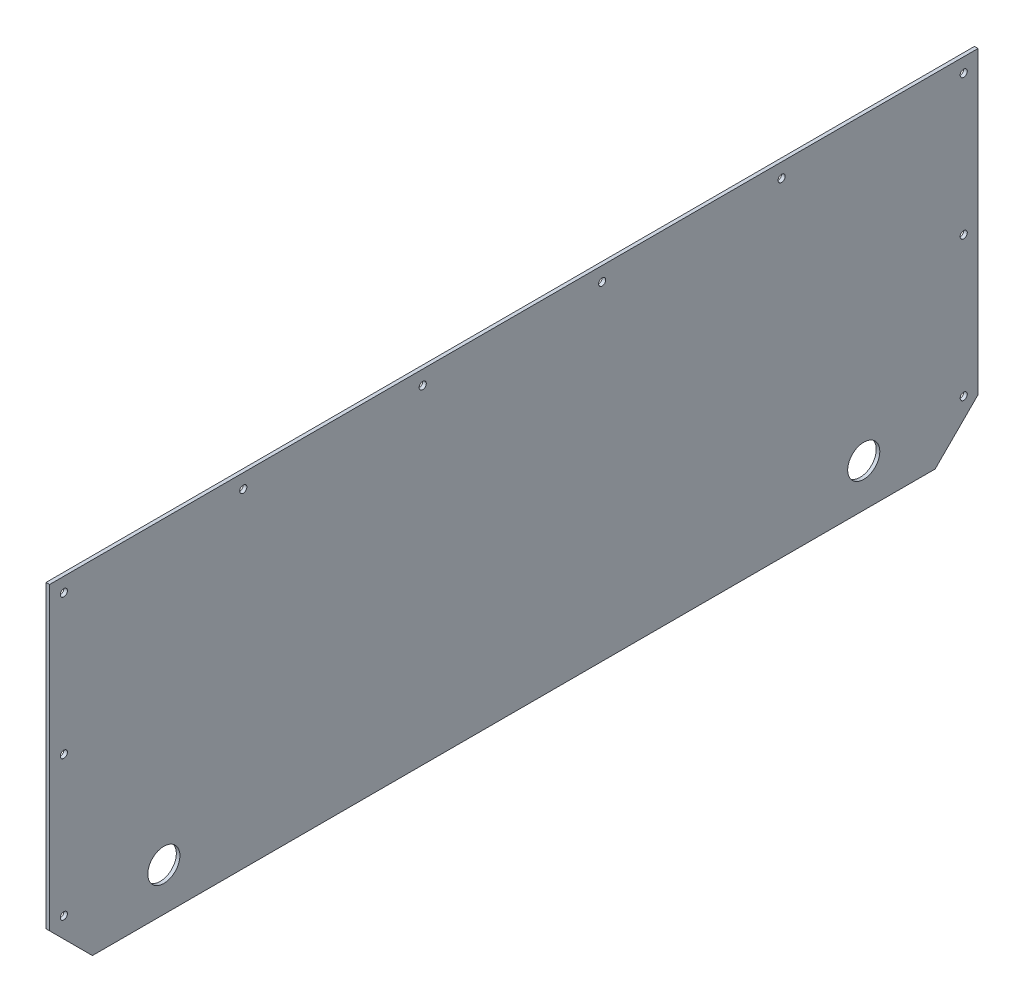
ISO-10303-21;
HEADER;
FILE_DESCRIPTION(('STEP AP214'),'2;1');
FILE_NAME('part.step','',(''),(''),'','','');
FILE_SCHEMA(('AUTOMOTIVE_DESIGN { 1 0 10303 214 1 1 1 1 }'));
ENDSEC;
DATA;
#1=APPLICATION_CONTEXT('core data for automotive mechanical design processes');
#2=APPLICATION_PROTOCOL_DEFINITION('international standard','automotive_design',2000,#1);
#3=PRODUCT_CONTEXT('',#1,'mechanical');
#4=PRODUCT('Part','Part','',(#3));
#5=PRODUCT_RELATED_PRODUCT_CATEGORY('part','',(#4));
#6=PRODUCT_DEFINITION_FORMATION('','',#4);
#7=PRODUCT_DEFINITION_CONTEXT('part definition',#1,'design');
#8=PRODUCT_DEFINITION('design','',#6,#7);
#9=PRODUCT_DEFINITION_SHAPE('','',#8);
#10=(LENGTH_UNIT() NAMED_UNIT(*) SI_UNIT(.MILLI.,.METRE.));
#11=(NAMED_UNIT(*) PLANE_ANGLE_UNIT() SI_UNIT($,.RADIAN.));
#12=(NAMED_UNIT(*) SI_UNIT($,.STERADIAN.) SOLID_ANGLE_UNIT());
#13=UNCERTAINTY_MEASURE_WITH_UNIT(LENGTH_MEASURE(1.E-05),#10,'distance_accuracy_value','');
#14=(GEOMETRIC_REPRESENTATION_CONTEXT(3) GLOBAL_UNCERTAINTY_ASSIGNED_CONTEXT((#13)) GLOBAL_UNIT_ASSIGNED_CONTEXT((#10,
#11,#12)) REPRESENTATION_CONTEXT('',''));
#15=CARTESIAN_POINT('',(0.,0.,0.));
#16=DIRECTION('',(0.,0.,1.));
#17=DIRECTION('',(1.,0.,0.));
#18=AXIS2_PLACEMENT_3D('',#15,#16,#17);
#19=CARTESIAN_POINT('',(3.175,0.,412.75));
#20=DIRECTION('',(-1.,0.,0.));
#21=DIRECTION('',(0.,0.,1.));
#22=AXIS2_PLACEMENT_3D('',#19,#20,#21);
#23=PLANE('',#22);
#24=CARTESIAN_POINT('',(3.175,43.3605122421383,-400.05));
#25=DIRECTION('',(1.,0.,0.));
#26=DIRECTION('',(0.,0.,1.));
#27=AXIS2_PLACEMENT_3D('',#24,#25,#26);
#28=CIRCLE('',#27,3.17499999999997);
#29=CARTESIAN_POINT('',(3.175,43.3605122421383,-396.875));
#30=VERTEX_POINT('',#29);
#31=EDGE_CURVE('E161',#30,#30,#28,.T.);
#32=ORIENTED_EDGE('',*,*,#31,.F.);
#33=EDGE_LOOP('',(#32));
#34=FACE_BOUND('',#33,.T.);
#35=CARTESIAN_POINT('',(3.175,167.730256121069,400.049999999999));
#36=DIRECTION('',(1.,0.,0.));
#37=DIRECTION('',(0.,0.,-1.));
#38=AXIS2_PLACEMENT_3D('',#35,#36,#37);
#39=CIRCLE('',#38,3.17499999999997);
#40=CARTESIAN_POINT('',(3.175,167.730256121069,396.874999999999));
#41=VERTEX_POINT('',#40);
#42=EDGE_CURVE('E154',#41,#41,#39,.T.);
#43=ORIENTED_EDGE('',*,*,#42,.F.);
#44=EDGE_LOOP('',(#43));
#45=FACE_BOUND('',#44,.T.);
#46=CARTESIAN_POINT('',(3.175,43.3605122421383,400.05));
#47=DIRECTION('',(1.,0.,0.));
#48=DIRECTION('',(0.,0.,-1.));
#49=AXIS2_PLACEMENT_3D('',#46,#47,#48);
#50=CIRCLE('',#49,3.17499999999997);
#51=CARTESIAN_POINT('',(3.175,43.3605122421383,396.875));
#52=VERTEX_POINT('',#51);
#53=EDGE_CURVE('E173',#52,#52,#50,.T.);
#54=ORIENTED_EDGE('',*,*,#53,.F.);
#55=EDGE_LOOP('',(#54));
#56=FACE_BOUND('',#55,.T.);
#57=CARTESIAN_POINT('',(3.175,292.1,-400.05));
#58=DIRECTION('',(1.,0.,0.));
#59=DIRECTION('',(0.,0.,1.));
#60=AXIS2_PLACEMENT_3D('',#57,#58,#59);
#61=CIRCLE('',#60,3.17499999999997);
#62=CARTESIAN_POINT('',(3.175,292.1,-396.875));
#63=VERTEX_POINT('',#62);
#64=EDGE_CURVE('E166',#63,#63,#61,.T.);
#65=ORIENTED_EDGE('',*,*,#64,.F.);
#66=EDGE_LOOP('',(#65));
#67=FACE_BOUND('',#66,.T.);
#68=CARTESIAN_POINT('',(3.175,38.1,-311.15));
#69=DIRECTION('',(1.,0.,0.));
#70=DIRECTION('',(0.,0.,-1.));
#71=AXIS2_PLACEMENT_3D('',#68,#69,#70);
#72=CIRCLE('',#71,14.2875);
#73=CARTESIAN_POINT('',(3.175,38.1,-325.4375));
#74=VERTEX_POINT('',#73);
#75=EDGE_CURVE('E138',#74,#74,#72,.T.);
#76=ORIENTED_EDGE('',*,*,#75,.F.);
#77=EDGE_LOOP('',(#76));
#78=FACE_BOUND('',#77,.T.);
#79=CARTESIAN_POINT('',(3.175,292.1,400.05));
#80=DIRECTION('',(1.,0.,0.));
#81=DIRECTION('',(0.,0.,-1.));
#82=AXIS2_PLACEMENT_3D('',#79,#80,#81);
#83=CIRCLE('',#82,3.17499999999997);
#84=CARTESIAN_POINT('',(3.175,292.1,396.875));
#85=VERTEX_POINT('',#84);
#86=EDGE_CURVE('E145',#85,#85,#83,.T.);
#87=ORIENTED_EDGE('',*,*,#86,.F.);
#88=EDGE_LOOP('',(#87));
#89=FACE_BOUND('',#88,.T.);
#90=CARTESIAN_POINT('',(3.175,292.1,-238.125));
#91=DIRECTION('',(1.,0.,0.));
#92=DIRECTION('',(0.,0.,-1.));
#93=AXIS2_PLACEMENT_3D('',#90,#91,#92);
#94=CIRCLE('',#93,3.17499999999997);
#95=CARTESIAN_POINT('',(3.175,292.1,-241.3));
#96=VERTEX_POINT('',#95);
#97=EDGE_CURVE('E202',#96,#96,#94,.T.);
#98=ORIENTED_EDGE('',*,*,#97,.F.);
#99=EDGE_LOOP('',(#98));
#100=FACE_BOUND('',#99,.T.);
#101=CARTESIAN_POINT('',(3.175,167.730256121069,-400.049999999999));
#102=DIRECTION('',(1.,0.,0.));
#103=DIRECTION('',(0.,0.,1.));
#104=AXIS2_PLACEMENT_3D('',#101,#102,#103);
#105=CIRCLE('',#104,3.17499999999997);
#106=CARTESIAN_POINT('',(3.175,167.730256121069,-396.874999999999));
#107=VERTEX_POINT('',#106);
#108=EDGE_CURVE('E185',#107,#107,#105,.T.);
#109=ORIENTED_EDGE('',*,*,#108,.F.);
#110=EDGE_LOOP('',(#109));
#111=FACE_BOUND('',#110,.T.);
#112=CARTESIAN_POINT('',(3.175,292.1,240.50625));
#113=DIRECTION('',(1.,0.,0.));
#114=DIRECTION('',(0.,0.,-1.));
#115=AXIS2_PLACEMENT_3D('',#112,#113,#114);
#116=CIRCLE('',#115,3.175);
#117=CARTESIAN_POINT('',(3.175,292.1,237.33125));
#118=VERTEX_POINT('',#117);
#119=EDGE_CURVE('E178',#118,#118,#116,.T.);
#120=ORIENTED_EDGE('',*,*,#119,.F.);
#121=EDGE_LOOP('',(#120));
#122=FACE_BOUND('',#121,.T.);
#123=CARTESIAN_POINT('',(3.175,292.1,80.9625));
#124=DIRECTION('',(1.,0.,0.));
#125=DIRECTION('',(0.,0.,-1.));
#126=AXIS2_PLACEMENT_3D('',#123,#124,#125);
#127=CIRCLE('',#126,3.17499999999997);
#128=CARTESIAN_POINT('',(3.175,292.1,77.7875));
#129=VERTEX_POINT('',#128);
#130=EDGE_CURVE('E197',#129,#129,#127,.T.);
#131=ORIENTED_EDGE('',*,*,#130,.F.);
#132=EDGE_LOOP('',(#131));
#133=FACE_BOUND('',#132,.T.);
#134=CARTESIAN_POINT('',(3.175,292.1,-78.58125));
#135=DIRECTION('',(1.,0.,0.));
#136=DIRECTION('',(0.,0.,-1.));
#137=AXIS2_PLACEMENT_3D('',#134,#135,#136);
#138=CIRCLE('',#137,3.17499999999997);
#139=CARTESIAN_POINT('',(3.175,292.1,-81.75625));
#140=VERTEX_POINT('',#139);
#141=EDGE_CURVE('E190',#140,#140,#138,.T.);
#142=ORIENTED_EDGE('',*,*,#141,.F.);
#143=EDGE_LOOP('',(#142));
#144=FACE_BOUND('',#143,.T.);
#145=CARTESIAN_POINT('',(3.175,38.1,311.15));
#146=DIRECTION('',(1.,0.,0.));
#147=DIRECTION('',(0.,0.,-1.));
#148=AXIS2_PLACEMENT_3D('',#145,#146,#147);
#149=CIRCLE('',#148,14.2875);
#150=CARTESIAN_POINT('',(3.175,38.1,296.8625));
#151=VERTEX_POINT('',#150);
#152=EDGE_CURVE('E128',#151,#151,#149,.T.);
#153=ORIENTED_EDGE('',*,*,#152,.F.);
#154=EDGE_LOOP('',(#153));
#155=FACE_BOUND('',#154,.T.);
#156=DIRECTION('',(0.,1.,0.));
#157=VECTOR('',#156,1.);
#158=CARTESIAN_POINT('',(3.175,0.,412.75));
#159=LINE('',#158,#157);
#160=CARTESIAN_POINT('',(3.175,38.1,412.75));
#161=VERTEX_POINT('',#160);
#162=CARTESIAN_POINT('',(3.175,304.8,412.75));
#163=VERTEX_POINT('',#162);
#164=EDGE_CURVE('E116',#161,#163,#159,.T.);
#165=ORIENTED_EDGE('',*,*,#164,.F.);
#166=DIRECTION('',(0.,0.707106781186547,0.707106781186548));
#167=VECTOR('',#166,1.);
#168=CARTESIAN_POINT('',(3.175,38.1,412.75));
#169=LINE('',#168,#167);
#170=CARTESIAN_POINT('',(3.175,0.,374.65));
#171=VERTEX_POINT('',#170);
#172=EDGE_CURVE('E51',#171,#161,#169,.T.);
#173=ORIENTED_EDGE('',*,*,#172,.F.);
#174=DIRECTION('',(0.,0.,-1.));
#175=VECTOR('',#174,1.);
#176=CARTESIAN_POINT('',(3.175,0.,412.75));
#177=LINE('',#176,#175);
#178=CARTESIAN_POINT('',(3.175,0.,-374.65));
#179=VERTEX_POINT('',#178);
#180=EDGE_CURVE('E110',#171,#179,#177,.T.);
#181=ORIENTED_EDGE('',*,*,#180,.T.);
#182=DIRECTION('',(0.,-0.707106781186547,0.707106781186548));
#183=VECTOR('',#182,1.);
#184=CARTESIAN_POINT('',(3.175,38.1,-412.75));
#185=LINE('',#184,#183);
#186=CARTESIAN_POINT('',(3.175,38.1,-412.75));
#187=VERTEX_POINT('',#186);
#188=EDGE_CURVE('E90',#187,#179,#185,.T.);
#189=ORIENTED_EDGE('',*,*,#188,.F.);
#190=DIRECTION('',(0.,1.,0.));
#191=VECTOR('',#190,1.);
#192=CARTESIAN_POINT('',(3.175,0.,-412.75));
#193=LINE('',#192,#191);
#194=CARTESIAN_POINT('',(3.175,304.8,-412.75));
#195=VERTEX_POINT('',#194);
#196=EDGE_CURVE('E120',#187,#195,#193,.T.);
#197=ORIENTED_EDGE('',*,*,#196,.T.);
#198=DIRECTION('',(0.,0.,-1.));
#199=VECTOR('',#198,1.);
#200=CARTESIAN_POINT('',(3.175,304.8,412.75));
#201=LINE('',#200,#199);
#202=EDGE_CURVE('E11',#163,#195,#201,.T.);
#203=ORIENTED_EDGE('',*,*,#202,.F.);
#204=EDGE_LOOP('',(#165,#173,#181,#189,#197,#203));
#205=FACE_BOUND('',#204,.T.);
#206=ADVANCED_FACE('F37',(#34,#45,#56,#67,#78,#89,#100,#111,#122,#133,#144,#155,#205),#23,.F.);
#207=CARTESIAN_POINT('',(0.,304.8,412.75));
#208=DIRECTION('',(0.,1.,0.));
#209=DIRECTION('',(0.,0.,1.));
#210=AXIS2_PLACEMENT_3D('',#207,#208,#209);
#211=PLANE('',#210);
#212=DIRECTION('',(1.,0.,0.));
#213=VECTOR('',#212,1.);
#214=CARTESIAN_POINT('',(0.,304.8,-412.75));
#215=LINE('',#214,#213);
#216=CARTESIAN_POINT('',(0.,304.8,-412.75));
#217=VERTEX_POINT('',#216);
#218=EDGE_CURVE('E117',#217,#195,#215,.T.);
#219=ORIENTED_EDGE('',*,*,#218,.F.);
#220=DIRECTION('',(0.,0.,-1.));
#221=VECTOR('',#220,1.);
#222=CARTESIAN_POINT('',(0.,304.8,412.75));
#223=LINE('',#222,#221);
#224=CARTESIAN_POINT('',(0.,304.8,412.75));
#225=VERTEX_POINT('',#224);
#226=EDGE_CURVE('E44',#225,#217,#223,.T.);
#227=ORIENTED_EDGE('',*,*,#226,.F.);
#228=DIRECTION('',(1.,0.,0.));
#229=VECTOR('',#228,1.);
#230=CARTESIAN_POINT('',(0.,304.8,412.75));
#231=LINE('',#230,#229);
#232=EDGE_CURVE('E124',#225,#163,#231,.T.);
#233=ORIENTED_EDGE('',*,*,#232,.T.);
#234=ORIENTED_EDGE('',*,*,#202,.T.);
#235=EDGE_LOOP('',(#219,#227,#233,#234));
#236=FACE_BOUND('',#235,.T.);
#237=ADVANCED_FACE('F220',(#236),#211,.T.);
#238=CARTESIAN_POINT('',(0.,0.,412.75));
#239=DIRECTION('',(-1.,0.,0.));
#240=DIRECTION('',(0.,0.,1.));
#241=AXIS2_PLACEMENT_3D('',#238,#239,#240);
#242=PLANE('',#241);
#243=CARTESIAN_POINT('',(0.,43.3605122421383,-400.05));
#244=DIRECTION('',(1.,0.,0.));
#245=DIRECTION('',(0.,0.,1.));
#246=AXIS2_PLACEMENT_3D('',#243,#244,#245);
#247=CIRCLE('',#246,3.17499999999997);
#248=CARTESIAN_POINT('',(0.,43.3605122421383,-396.875));
#249=VERTEX_POINT('',#248);
#250=EDGE_CURVE('E149',#249,#249,#247,.T.);
#251=ORIENTED_EDGE('',*,*,#250,.T.);
#252=EDGE_LOOP('',(#251));
#253=FACE_BOUND('',#252,.T.);
#254=CARTESIAN_POINT('',(0.,167.730256121069,400.049999999999));
#255=DIRECTION('',(1.,0.,0.));
#256=DIRECTION('',(0.,0.,-1.));
#257=AXIS2_PLACEMENT_3D('',#254,#255,#256);
#258=CIRCLE('',#257,3.17499999999997);
#259=CARTESIAN_POINT('',(0.,167.730256121069,396.874999999999));
#260=VERTEX_POINT('',#259);
#261=EDGE_CURVE('E157',#260,#260,#258,.T.);
#262=ORIENTED_EDGE('',*,*,#261,.T.);
#263=EDGE_LOOP('',(#262));
#264=FACE_BOUND('',#263,.T.);
#265=CARTESIAN_POINT('',(0.,43.3605122421383,400.05));
#266=DIRECTION('',(1.,0.,0.));
#267=DIRECTION('',(0.,0.,-1.));
#268=AXIS2_PLACEMENT_3D('',#265,#266,#267);
#269=CIRCLE('',#268,3.17499999999997);
#270=CARTESIAN_POINT('',(0.,43.3605122421383,396.875));
#271=VERTEX_POINT('',#270);
#272=EDGE_CURVE('E158',#271,#271,#269,.T.);
#273=ORIENTED_EDGE('',*,*,#272,.T.);
#274=EDGE_LOOP('',(#273));
#275=FACE_BOUND('',#274,.T.);
#276=CARTESIAN_POINT('',(0.,292.1,-400.05));
#277=DIRECTION('',(1.,0.,0.));
#278=DIRECTION('',(0.,0.,1.));
#279=AXIS2_PLACEMENT_3D('',#276,#277,#278);
#280=CIRCLE('',#279,3.17499999999997);
#281=CARTESIAN_POINT('',(0.,292.1,-396.875));
#282=VERTEX_POINT('',#281);
#283=EDGE_CURVE('E169',#282,#282,#280,.T.);
#284=ORIENTED_EDGE('',*,*,#283,.T.);
#285=EDGE_LOOP('',(#284));
#286=FACE_BOUND('',#285,.T.);
#287=CARTESIAN_POINT('',(0.,38.1,-311.15));
#288=DIRECTION('',(1.,0.,0.));
#289=DIRECTION('',(0.,0.,-1.));
#290=AXIS2_PLACEMENT_3D('',#287,#288,#289);
#291=CIRCLE('',#290,14.2875);
#292=CARTESIAN_POINT('',(0.,38.1,-325.4375));
#293=VERTEX_POINT('',#292);
#294=EDGE_CURVE('E131',#293,#293,#291,.T.);
#295=ORIENTED_EDGE('',*,*,#294,.T.);
#296=EDGE_LOOP('',(#295));
#297=FACE_BOUND('',#296,.T.);
#298=DIRECTION('',(0.,0.707106781186547,0.707106781186548));
#299=VECTOR('',#298,1.);
#300=CARTESIAN_POINT('',(0.,38.1,412.75));
#301=LINE('',#300,#299);
#302=CARTESIAN_POINT('',(0.,0.,374.65));
#303=VERTEX_POINT('',#302);
#304=CARTESIAN_POINT('',(0.,38.1,412.75));
#305=VERTEX_POINT('',#304);
#306=EDGE_CURVE('E136',#303,#305,#301,.T.);
#307=ORIENTED_EDGE('',*,*,#306,.T.);
#308=DIRECTION('',(0.,1.,0.));
#309=VECTOR('',#308,1.);
#310=CARTESIAN_POINT('',(0.,0.,412.75));
#311=LINE('',#310,#309);
#312=EDGE_CURVE('E112',#305,#225,#311,.T.);
#313=ORIENTED_EDGE('',*,*,#312,.T.);
#314=ORIENTED_EDGE('',*,*,#226,.T.);
#315=DIRECTION('',(0.,1.,0.));
#316=VECTOR('',#315,1.);
#317=CARTESIAN_POINT('',(0.,0.,-412.75));
#318=LINE('',#317,#316);
#319=CARTESIAN_POINT('',(0.,38.1,-412.75));
#320=VERTEX_POINT('',#319);
#321=EDGE_CURVE('E105',#320,#217,#318,.T.);
#322=ORIENTED_EDGE('',*,*,#321,.F.);
#323=DIRECTION('',(0.,-0.707106781186547,0.707106781186548));
#324=VECTOR('',#323,1.);
#325=CARTESIAN_POINT('',(0.,38.1,-412.75));
#326=LINE('',#325,#324);
#327=CARTESIAN_POINT('',(0.,0.,-374.65));
#328=VERTEX_POINT('',#327);
#329=EDGE_CURVE('E59',#320,#328,#326,.T.);
#330=ORIENTED_EDGE('',*,*,#329,.T.);
#331=DIRECTION('',(0.,0.,-1.));
#332=VECTOR('',#331,1.);
#333=CARTESIAN_POINT('',(0.,0.,412.75));
#334=LINE('',#333,#332);
#335=EDGE_CURVE('E103',#303,#328,#334,.T.);
#336=ORIENTED_EDGE('',*,*,#335,.F.);
#337=EDGE_LOOP('',(#307,#313,#314,#322,#330,#336));
#338=FACE_BOUND('',#337,.T.);
#339=CARTESIAN_POINT('',(0.,292.1,400.05));
#340=DIRECTION('',(1.,0.,0.));
#341=DIRECTION('',(0.,0.,-1.));
#342=AXIS2_PLACEMENT_3D('',#339,#340,#341);
#343=CIRCLE('',#342,3.17499999999997);
#344=CARTESIAN_POINT('',(0.,292.1,396.875));
#345=VERTEX_POINT('',#344);
#346=EDGE_CURVE('E148',#345,#345,#343,.T.);
#347=ORIENTED_EDGE('',*,*,#346,.T.);
#348=EDGE_LOOP('',(#347));
#349=FACE_BOUND('',#348,.T.);
#350=CARTESIAN_POINT('',(0.,292.1,-238.125));
#351=DIRECTION('',(1.,0.,0.));
#352=DIRECTION('',(0.,0.,-1.));
#353=AXIS2_PLACEMENT_3D('',#350,#351,#352);
#354=CIRCLE('',#353,3.17499999999997);
#355=CARTESIAN_POINT('',(0.,292.1,-241.3));
#356=VERTEX_POINT('',#355);
#357=EDGE_CURVE('E194',#356,#356,#354,.T.);
#358=ORIENTED_EDGE('',*,*,#357,.T.);
#359=EDGE_LOOP('',(#358));
#360=FACE_BOUND('',#359,.T.);
#361=CARTESIAN_POINT('',(0.,167.730256121069,-400.049999999999));
#362=DIRECTION('',(1.,0.,0.));
#363=DIRECTION('',(0.,0.,1.));
#364=AXIS2_PLACEMENT_3D('',#361,#362,#363);
#365=CIRCLE('',#364,3.17499999999997);
#366=CARTESIAN_POINT('',(0.,167.730256121069,-396.874999999999));
#367=VERTEX_POINT('',#366);
#368=EDGE_CURVE('E170',#367,#367,#365,.T.);
#369=ORIENTED_EDGE('',*,*,#368,.T.);
#370=EDGE_LOOP('',(#369));
#371=FACE_BOUND('',#370,.T.);
#372=CARTESIAN_POINT('',(0.,292.1,240.50625));
#373=DIRECTION('',(1.,0.,0.));
#374=DIRECTION('',(0.,0.,-1.));
#375=AXIS2_PLACEMENT_3D('',#372,#373,#374);
#376=CIRCLE('',#375,3.175);
#377=CARTESIAN_POINT('',(0.,292.1,237.33125));
#378=VERTEX_POINT('',#377);
#379=EDGE_CURVE('E181',#378,#378,#376,.T.);
#380=ORIENTED_EDGE('',*,*,#379,.T.);
#381=EDGE_LOOP('',(#380));
#382=FACE_BOUND('',#381,.T.);
#383=CARTESIAN_POINT('',(0.,292.1,80.9625));
#384=DIRECTION('',(1.,0.,0.));
#385=DIRECTION('',(0.,0.,-1.));
#386=AXIS2_PLACEMENT_3D('',#383,#384,#385);
#387=CIRCLE('',#386,3.17499999999997);
#388=CARTESIAN_POINT('',(0.,292.1,77.7875));
#389=VERTEX_POINT('',#388);
#390=EDGE_CURVE('E182',#389,#389,#387,.T.);
#391=ORIENTED_EDGE('',*,*,#390,.T.);
#392=EDGE_LOOP('',(#391));
#393=FACE_BOUND('',#392,.T.);
#394=CARTESIAN_POINT('',(0.,292.1,-78.58125));
#395=DIRECTION('',(1.,0.,0.));
#396=DIRECTION('',(0.,0.,-1.));
#397=AXIS2_PLACEMENT_3D('',#394,#395,#396);
#398=CIRCLE('',#397,3.17499999999997);
#399=CARTESIAN_POINT('',(0.,292.1,-81.75625));
#400=VERTEX_POINT('',#399);
#401=EDGE_CURVE('E193',#400,#400,#398,.T.);
#402=ORIENTED_EDGE('',*,*,#401,.T.);
#403=EDGE_LOOP('',(#402));
#404=FACE_BOUND('',#403,.T.);
#405=CARTESIAN_POINT('',(0.,38.1,311.15));
#406=DIRECTION('',(1.,0.,0.));
#407=DIRECTION('',(0.,0.,-1.));
#408=AXIS2_PLACEMENT_3D('',#405,#406,#407);
#409=CIRCLE('',#408,14.2875);
#410=CARTESIAN_POINT('',(0.,38.1,296.8625));
#411=VERTEX_POINT('',#410);
#412=EDGE_CURVE('E122',#411,#411,#409,.T.);
#413=ORIENTED_EDGE('',*,*,#412,.T.);
#414=EDGE_LOOP('',(#413));
#415=FACE_BOUND('',#414,.T.);
#416=ADVANCED_FACE('F101',(#253,#264,#275,#286,#297,#338,#349,#360,#371,#382,#393,#404,#415),
#242,.T.);
#417=CARTESIAN_POINT('',(3.175,0.,412.75));
#418=DIRECTION('',(0.,-1.,0.));
#419=DIRECTION('',(0.,0.,-1.));
#420=AXIS2_PLACEMENT_3D('',#417,#418,#419);
#421=PLANE('',#420);
#422=DIRECTION('',(1.,0.,0.));
#423=VECTOR('',#422,1.);
#424=CARTESIAN_POINT('',(0.,0.,374.65));
#425=LINE('',#424,#423);
#426=EDGE_CURVE('E109',#303,#171,#425,.T.);
#427=ORIENTED_EDGE('',*,*,#426,.F.);
#428=ORIENTED_EDGE('',*,*,#335,.T.);
#429=DIRECTION('',(1.,0.,0.));
#430=VECTOR('',#429,1.);
#431=CARTESIAN_POINT('',(0.,0.,-374.65));
#432=LINE('',#431,#430);
#433=EDGE_CURVE('E87',#328,#179,#432,.T.);
#434=ORIENTED_EDGE('',*,*,#433,.T.);
#435=ORIENTED_EDGE('',*,*,#180,.F.);
#436=EDGE_LOOP('',(#427,#428,#434,#435));
#437=FACE_BOUND('',#436,.T.);
#438=ADVANCED_FACE('F108',(#437),#421,.T.);
#439=CARTESIAN_POINT('',(0.,0.,412.75));
#440=DIRECTION('',(0.,0.,-1.));
#441=DIRECTION('',(-1.,0.,0.));
#442=AXIS2_PLACEMENT_3D('',#439,#440,#441);
#443=PLANE('',#442);
#444=ORIENTED_EDGE('',*,*,#312,.F.);
#445=DIRECTION('',(1.,0.,0.));
#446=VECTOR('',#445,1.);
#447=CARTESIAN_POINT('',(0.,38.1,412.75));
#448=LINE('',#447,#446);
#449=EDGE_CURVE('E135',#305,#161,#448,.T.);
#450=ORIENTED_EDGE('',*,*,#449,.T.);
#451=ORIENTED_EDGE('',*,*,#164,.T.);
#452=ORIENTED_EDGE('',*,*,#232,.F.);
#453=EDGE_LOOP('',(#444,#450,#451,#452));
#454=FACE_BOUND('',#453,.T.);
#455=ADVANCED_FACE('F237',(#454),#443,.F.);
#456=CARTESIAN_POINT('',(0.,0.,-412.75));
#457=DIRECTION('',(0.,0.,-1.));
#458=DIRECTION('',(-1.,0.,0.));
#459=AXIS2_PLACEMENT_3D('',#456,#457,#458);
#460=PLANE('',#459);
#461=DIRECTION('',(1.,0.,0.));
#462=VECTOR('',#461,1.);
#463=CARTESIAN_POINT('',(0.,38.1,-412.75));
#464=LINE('',#463,#462);
#465=EDGE_CURVE('E95',#320,#187,#464,.T.);
#466=ORIENTED_EDGE('',*,*,#465,.F.);
#467=ORIENTED_EDGE('',*,*,#321,.T.);
#468=ORIENTED_EDGE('',*,*,#218,.T.);
#469=ORIENTED_EDGE('',*,*,#196,.F.);
#470=EDGE_LOOP('',(#466,#467,#468,#469));
#471=FACE_BOUND('',#470,.T.);
#472=ADVANCED_FACE('F244',(#471),#460,.T.);
#473=CARTESIAN_POINT('',(0.,38.1,-412.75));
#474=DIRECTION('',(0.,0.707106781186548,0.707106781186547));
#475=DIRECTION('',(0.,-0.707106781186547,0.707106781186548));
#476=AXIS2_PLACEMENT_3D('',#473,#474,#475);
#477=PLANE('',#476);
#478=ORIENTED_EDGE('',*,*,#188,.T.);
#479=ORIENTED_EDGE('',*,*,#433,.F.);
#480=ORIENTED_EDGE('',*,*,#329,.F.);
#481=ORIENTED_EDGE('',*,*,#465,.T.);
#482=EDGE_LOOP('',(#478,#479,#480,#481));
#483=FACE_BOUND('',#482,.T.);
#484=ADVANCED_FACE('F88',(#483),#477,.F.);
#485=CARTESIAN_POINT('',(0.,38.1,412.75));
#486=DIRECTION('',(0.,0.707106781186548,-0.707106781186547));
#487=DIRECTION('',(0.,0.707106781186547,0.707106781186548));
#488=AXIS2_PLACEMENT_3D('',#485,#486,#487);
#489=PLANE('',#488);
#490=ORIENTED_EDGE('',*,*,#172,.T.);
#491=ORIENTED_EDGE('',*,*,#449,.F.);
#492=ORIENTED_EDGE('',*,*,#306,.F.);
#493=ORIENTED_EDGE('',*,*,#426,.T.);
#494=EDGE_LOOP('',(#490,#491,#492,#493));
#495=FACE_BOUND('',#494,.T.);
#496=ADVANCED_FACE('F238',(#495),#489,.F.);
#497=CARTESIAN_POINT('',(0.,38.1,311.15));
#498=DIRECTION('',(1.,0.,0.));
#499=DIRECTION('',(0.,0.,-1.));
#500=AXIS2_PLACEMENT_3D('',#497,#498,#499);
#501=CYLINDRICAL_SURFACE('',#500,14.2875);
#502=ORIENTED_EDGE('',*,*,#412,.F.);
#503=EDGE_LOOP('',(#502));
#504=FACE_BOUND('',#503,.T.);
#505=ORIENTED_EDGE('',*,*,#152,.T.);
#506=EDGE_LOOP('',(#505));
#507=FACE_BOUND('',#506,.T.);
#508=ADVANCED_FACE('F298',(#504,#507),#501,.F.);
#509=CARTESIAN_POINT('',(0.,292.1,-78.58125));
#510=DIRECTION('',(1.,0.,0.));
#511=DIRECTION('',(0.,0.,-1.));
#512=AXIS2_PLACEMENT_3D('',#509,#510,#511);
#513=CYLINDRICAL_SURFACE('',#512,3.17499999999997);
#514=ORIENTED_EDGE('',*,*,#401,.F.);
#515=EDGE_LOOP('',(#514));
#516=FACE_BOUND('',#515,.T.);
#517=ORIENTED_EDGE('',*,*,#141,.T.);
#518=EDGE_LOOP('',(#517));
#519=FACE_BOUND('',#518,.T.);
#520=ADVANCED_FACE('F308',(#516,#519),#513,.F.);
#521=CARTESIAN_POINT('',(0.,292.1,80.9625));
#522=DIRECTION('',(1.,0.,0.));
#523=DIRECTION('',(0.,0.,-1.));
#524=AXIS2_PLACEMENT_3D('',#521,#522,#523);
#525=CYLINDRICAL_SURFACE('',#524,3.17499999999997);
#526=ORIENTED_EDGE('',*,*,#390,.F.);
#527=EDGE_LOOP('',(#526));
#528=FACE_BOUND('',#527,.T.);
#529=ORIENTED_EDGE('',*,*,#130,.T.);
#530=EDGE_LOOP('',(#529));
#531=FACE_BOUND('',#530,.T.);
#532=ADVANCED_FACE('F318',(#528,#531),#525,.F.);
#533=CARTESIAN_POINT('',(0.,292.1,240.50625));
#534=DIRECTION('',(1.,0.,0.));
#535=DIRECTION('',(0.,0.,-1.));
#536=AXIS2_PLACEMENT_3D('',#533,#534,#535);
#537=CYLINDRICAL_SURFACE('',#536,3.175);
#538=ORIENTED_EDGE('',*,*,#379,.F.);
#539=EDGE_LOOP('',(#538));
#540=FACE_BOUND('',#539,.T.);
#541=ORIENTED_EDGE('',*,*,#119,.T.);
#542=EDGE_LOOP('',(#541));
#543=FACE_BOUND('',#542,.T.);
#544=ADVANCED_FACE('F329',(#540,#543),#537,.F.);
#545=CARTESIAN_POINT('',(0.,167.730256121069,-400.049999999999));
#546=DIRECTION('',(1.,0.,0.));
#547=DIRECTION('',(0.,0.,-1.));
#548=AXIS2_PLACEMENT_3D('',#545,#546,#547);
#549=CYLINDRICAL_SURFACE('',#548,3.17499999999997);
#550=ORIENTED_EDGE('',*,*,#368,.F.);
#551=EDGE_LOOP('',(#550));
#552=FACE_BOUND('',#551,.T.);
#553=ORIENTED_EDGE('',*,*,#108,.T.);
#554=EDGE_LOOP('',(#553));
#555=FACE_BOUND('',#554,.T.);
#556=ADVANCED_FACE('F214',(#552,#555),#549,.F.);
#557=CARTESIAN_POINT('',(0.,292.1,-238.125));
#558=DIRECTION('',(1.,0.,0.));
#559=DIRECTION('',(0.,0.,-1.));
#560=AXIS2_PLACEMENT_3D('',#557,#558,#559);
#561=CYLINDRICAL_SURFACE('',#560,3.17499999999997);
#562=ORIENTED_EDGE('',*,*,#357,.F.);
#563=EDGE_LOOP('',(#562));
#564=FACE_BOUND('',#563,.T.);
#565=ORIENTED_EDGE('',*,*,#97,.T.);
#566=EDGE_LOOP('',(#565));
#567=FACE_BOUND('',#566,.T.);
#568=ADVANCED_FACE('F210',(#564,#567),#561,.F.);
#569=CARTESIAN_POINT('',(0.,292.1,400.05));
#570=DIRECTION('',(1.,0.,0.));
#571=DIRECTION('',(0.,0.,-1.));
#572=AXIS2_PLACEMENT_3D('',#569,#570,#571);
#573=CYLINDRICAL_SURFACE('',#572,3.17499999999997);
#574=ORIENTED_EDGE('',*,*,#346,.F.);
#575=EDGE_LOOP('',(#574));
#576=FACE_BOUND('',#575,.T.);
#577=ORIENTED_EDGE('',*,*,#86,.T.);
#578=EDGE_LOOP('',(#577));
#579=FACE_BOUND('',#578,.T.);
#580=ADVANCED_FACE('F213',(#576,#579),#573,.F.);
#581=CARTESIAN_POINT('',(0.,38.1,-311.15));
#582=DIRECTION('',(1.,0.,0.));
#583=DIRECTION('',(0.,0.,-1.));
#584=AXIS2_PLACEMENT_3D('',#581,#582,#583);
#585=CYLINDRICAL_SURFACE('',#584,14.2875);
#586=ORIENTED_EDGE('',*,*,#294,.F.);
#587=EDGE_LOOP('',(#586));
#588=FACE_BOUND('',#587,.T.);
#589=ORIENTED_EDGE('',*,*,#75,.T.);
#590=EDGE_LOOP('',(#589));
#591=FACE_BOUND('',#590,.T.);
#592=ADVANCED_FACE('F367',(#588,#591),#585,.F.);
#593=CARTESIAN_POINT('',(0.,292.1,-400.05));
#594=DIRECTION('',(1.,0.,0.));
#595=DIRECTION('',(0.,0.,-1.));
#596=AXIS2_PLACEMENT_3D('',#593,#594,#595);
#597=CYLINDRICAL_SURFACE('',#596,3.17499999999997);
#598=ORIENTED_EDGE('',*,*,#283,.F.);
#599=EDGE_LOOP('',(#598));
#600=FACE_BOUND('',#599,.T.);
#601=ORIENTED_EDGE('',*,*,#64,.T.);
#602=EDGE_LOOP('',(#601));
#603=FACE_BOUND('',#602,.T.);
#604=ADVANCED_FACE('F378',(#600,#603),#597,.F.);
#605=CARTESIAN_POINT('',(0.,43.3605122421383,400.05));
#606=DIRECTION('',(1.,0.,0.));
#607=DIRECTION('',(0.,0.,-1.));
#608=AXIS2_PLACEMENT_3D('',#605,#606,#607);
#609=CYLINDRICAL_SURFACE('',#608,3.17499999999997);
#610=ORIENTED_EDGE('',*,*,#272,.F.);
#611=EDGE_LOOP('',(#610));
#612=FACE_BOUND('',#611,.T.);
#613=ORIENTED_EDGE('',*,*,#53,.T.);
#614=EDGE_LOOP('',(#613));
#615=FACE_BOUND('',#614,.T.);
#616=ADVANCED_FACE('F389',(#612,#615),#609,.F.);
#617=CARTESIAN_POINT('',(0.,167.730256121069,400.049999999999));
#618=DIRECTION('',(1.,0.,0.));
#619=DIRECTION('',(0.,0.,-1.));
#620=AXIS2_PLACEMENT_3D('',#617,#618,#619);
#621=CYLINDRICAL_SURFACE('',#620,3.17499999999997);
#622=ORIENTED_EDGE('',*,*,#261,.F.);
#623=EDGE_LOOP('',(#622));
#624=FACE_BOUND('',#623,.T.);
#625=ORIENTED_EDGE('',*,*,#42,.T.);
#626=EDGE_LOOP('',(#625));
#627=FACE_BOUND('',#626,.T.);
#628=ADVANCED_FACE('F400',(#624,#627),#621,.F.);
#629=CARTESIAN_POINT('',(0.,43.3605122421383,-400.05));
#630=DIRECTION('',(1.,0.,0.));
#631=DIRECTION('',(0.,0.,-1.));
#632=AXIS2_PLACEMENT_3D('',#629,#630,#631);
#633=CYLINDRICAL_SURFACE('',#632,3.17499999999997);
#634=ORIENTED_EDGE('',*,*,#250,.F.);
#635=EDGE_LOOP('',(#634));
#636=FACE_BOUND('',#635,.T.);
#637=ORIENTED_EDGE('',*,*,#31,.T.);
#638=EDGE_LOOP('',(#637));
#639=FACE_BOUND('',#638,.T.);
#640=ADVANCED_FACE('F411',(#636,#639),#633,.F.);
#641=CLOSED_SHELL('',(#206,#237,#416,#438,#455,#472,#484,#496,#508,#520,#532,#544,#556,#568,
#580,#592,#604,#616,#628,#640));
#642=MANIFOLD_SOLID_BREP('B2',#641);
#643=ADVANCED_BREP_SHAPE_REPRESENTATION('',(#18,#642),#14);
#644=SHAPE_DEFINITION_REPRESENTATION(#9,#643);
ENDSEC;
END-ISO-10303-21;
